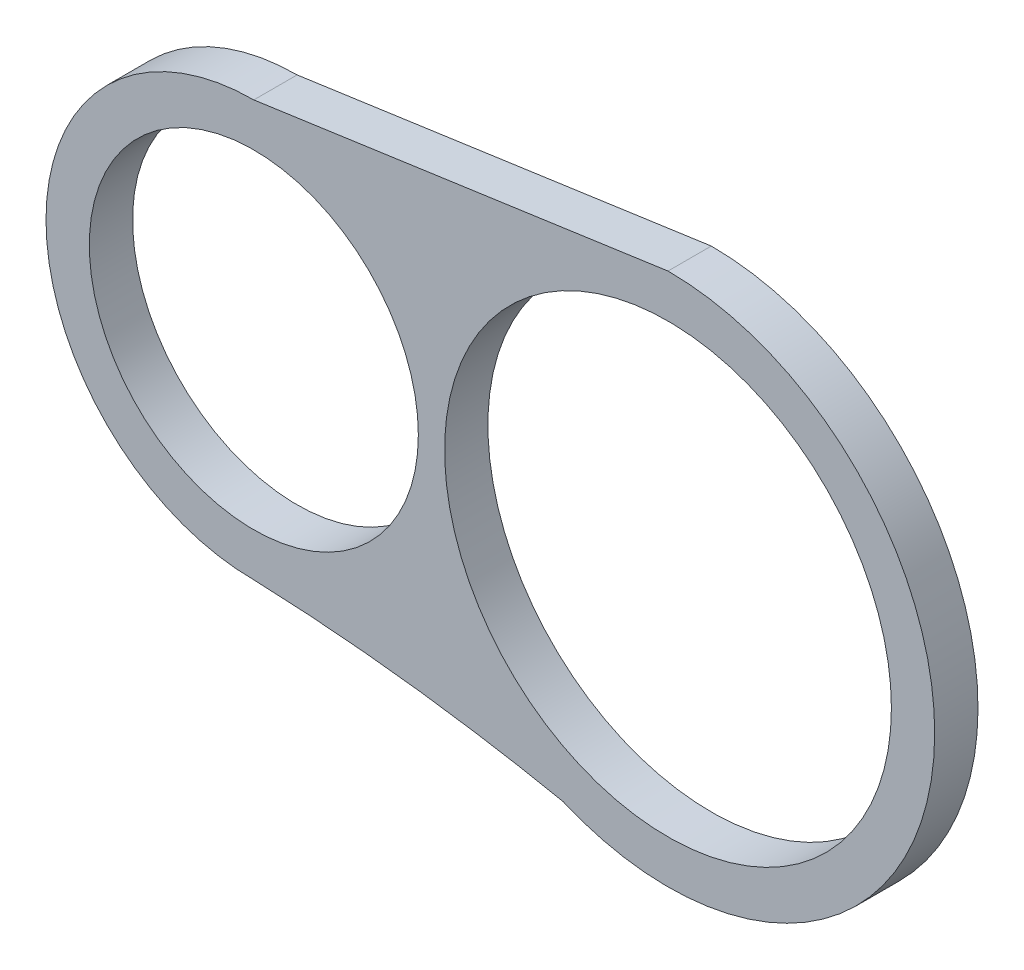
ISO-10303-21;
HEADER;
FILE_DESCRIPTION(('STEP AP214'),'2;1');
FILE_NAME('part.step','',(''),(''),'','','');
FILE_SCHEMA(('AUTOMOTIVE_DESIGN { 1 0 10303 214 1 1 1 1 }'));
ENDSEC;
DATA;
#1=APPLICATION_CONTEXT('core data for automotive mechanical design processes');
#2=APPLICATION_PROTOCOL_DEFINITION('international standard','automotive_design',2000,#1);
#3=PRODUCT_CONTEXT('',#1,'mechanical');
#4=PRODUCT('Part','Part','',(#3));
#5=PRODUCT_RELATED_PRODUCT_CATEGORY('part','',(#4));
#6=PRODUCT_DEFINITION_FORMATION('','',#4);
#7=PRODUCT_DEFINITION_CONTEXT('part definition',#1,'design');
#8=PRODUCT_DEFINITION('design','',#6,#7);
#9=PRODUCT_DEFINITION_SHAPE('','',#8);
#10=(LENGTH_UNIT() NAMED_UNIT(*) SI_UNIT(.MILLI.,.METRE.));
#11=(NAMED_UNIT(*) PLANE_ANGLE_UNIT() SI_UNIT($,.RADIAN.));
#12=(NAMED_UNIT(*) SI_UNIT($,.STERADIAN.) SOLID_ANGLE_UNIT());
#13=UNCERTAINTY_MEASURE_WITH_UNIT(LENGTH_MEASURE(1.E-05),#10,'distance_accuracy_value','');
#14=(GEOMETRIC_REPRESENTATION_CONTEXT(3) GLOBAL_UNCERTAINTY_ASSIGNED_CONTEXT((#13)) GLOBAL_UNIT_ASSIGNED_CONTEXT((#10,
#11,#12)) REPRESENTATION_CONTEXT('',''));
#15=CARTESIAN_POINT('',(0.,0.,0.));
#16=DIRECTION('',(0.,0.,1.));
#17=DIRECTION('',(1.,0.,0.));
#18=AXIS2_PLACEMENT_3D('',#15,#16,#17);
#19=CARTESIAN_POINT('',(-6.05642951738741,-25.4090840629229,5.));
#20=DIRECTION('',(0.,0.,1.));
#21=DIRECTION('',(1.,0.,0.));
#22=AXIS2_PLACEMENT_3D('',#19,#20,#21);
#23=PLANE('',#22);
#24=CARTESIAN_POINT('',(23.915,0.,5.));
#25=DIRECTION('',(0.,0.,1.));
#26=DIRECTION('',(1.,0.,0.));
#27=AXIS2_PLACEMENT_3D('',#24,#25,#26);
#28=CIRCLE('',#27,25.8);
#29=CARTESIAN_POINT('',(49.715,0.,5.));
#30=VERTEX_POINT('',#29);
#31=EDGE_CURVE('E108',#30,#30,#28,.T.);
#32=ORIENTED_EDGE('',*,*,#31,.F.);
#33=EDGE_LOOP('',(#32));
#34=FACE_BOUND('',#33,.T.);
#35=CARTESIAN_POINT('',(-23.915,-24.,5.));
#36=CARTESIAN_POINT('',(-6.05642951738735,-24.6590840629229,5.));
#37=CARTESIAN_POINT('',(11.8021409652251,-28.3181681258458,5.));
#38=B_SPLINE_CURVE_WITH_KNOTS('',2,(#35,#36,#37),.UNSPECIFIED.,.F.,.F.,(3,3),(0.,
0.746751849576107),.UNSPECIFIED.);
#39=CARTESIAN_POINT('',(-23.915,-24.,5.));
#40=VERTEX_POINT('',#39);
#41=CARTESIAN_POINT('',(11.8021409652251,-28.3181681258458,5.));
#42=VERTEX_POINT('',#41);
#43=EDGE_CURVE('E87',#40,#42,#38,.T.);
#44=ORIENTED_EDGE('',*,*,#43,.T.);
#45=CARTESIAN_POINT('',(23.915,0.,5.));
#46=DIRECTION('',(0.,0.,1.));
#47=DIRECTION('',(1.,0.,0.));
#48=AXIS2_PLACEMENT_3D('',#45,#46,#47);
#49=CIRCLE('',#48,30.8);
#50=CARTESIAN_POINT('',(23.9149999999999,30.8,5.));
#51=VERTEX_POINT('',#50);
#52=EDGE_CURVE('E82',#42,#51,#49,.T.);
#53=ORIENTED_EDGE('',*,*,#52,.T.);
#54=CARTESIAN_POINT('',(23.915,30.8,5.));
#55=CARTESIAN_POINT('',(-23.915,24.,5.));
#56=B_SPLINE_CURVE_WITH_KNOTS('',1,(#54,#55),.UNSPECIFIED.,.F.,.F.,(2,2),(0.,1.),.UNSPECIFIED.);
#57=CARTESIAN_POINT('',(-23.915,24.,5.));
#58=VERTEX_POINT('',#57);
#59=EDGE_CURVE('E85',#51,#58,#56,.T.);
#60=ORIENTED_EDGE('',*,*,#59,.T.);
#61=CARTESIAN_POINT('',(-23.915,0.,5.));
#62=DIRECTION('',(0.,0.,1.));
#63=DIRECTION('',(1.,0.,0.));
#64=AXIS2_PLACEMENT_3D('',#61,#62,#63);
#65=CIRCLE('',#64,24.);
#66=EDGE_CURVE('E52',#58,#40,#65,.T.);
#67=ORIENTED_EDGE('',*,*,#66,.T.);
#68=EDGE_LOOP('',(#44,#53,#60,#67));
#69=FACE_BOUND('',#68,.T.);
#70=CARTESIAN_POINT('',(-23.915,0.,5.));
#71=DIRECTION('',(0.,0.,1.));
#72=DIRECTION('',(1.,0.,0.));
#73=AXIS2_PLACEMENT_3D('',#70,#71,#72);
#74=CIRCLE('',#73,19.);
#75=CARTESIAN_POINT('',(-4.915,0.,5.));
#76=VERTEX_POINT('',#75);
#77=EDGE_CURVE('E137',#76,#76,#74,.T.);
#78=ORIENTED_EDGE('',*,*,#77,.F.);
#79=EDGE_LOOP('',(#78));
#80=FACE_BOUND('',#79,.T.);
#81=ADVANCED_FACE('F34',(#34,#69,#80),#23,.T.);
#82=CARTESIAN_POINT('',(-6.05642951738741,-25.4090840629229,0.));
#83=DIRECTION('',(0.,0.,1.));
#84=DIRECTION('',(1.,0.,0.));
#85=AXIS2_PLACEMENT_3D('',#82,#83,#84);
#86=PLANE('',#85);
#87=CARTESIAN_POINT('',(-23.915,-24.,0.));
#88=CARTESIAN_POINT('',(-6.05642951738735,-24.6590840629229,0.));
#89=CARTESIAN_POINT('',(11.8021409652251,-28.3181681258458,0.));
#90=B_SPLINE_CURVE_WITH_KNOTS('',2,(#87,#88,#89),.UNSPECIFIED.,.F.,.F.,(3,3),(0.,
0.746751849576107),.UNSPECIFIED.);
#91=CARTESIAN_POINT('',(-23.915,-24.,0.));
#92=VERTEX_POINT('',#91);
#93=CARTESIAN_POINT('',(11.8021409652251,-28.3181681258458,0.));
#94=VERTEX_POINT('',#93);
#95=EDGE_CURVE('E103',#92,#94,#90,.T.);
#96=ORIENTED_EDGE('',*,*,#95,.F.);
#97=CARTESIAN_POINT('',(-23.915,0.,0.));
#98=DIRECTION('',(0.,0.,1.));
#99=DIRECTION('',(1.,0.,0.));
#100=AXIS2_PLACEMENT_3D('',#97,#98,#99);
#101=CIRCLE('',#100,24.);
#102=CARTESIAN_POINT('',(-23.915,24.,0.));
#103=VERTEX_POINT('',#102);
#104=EDGE_CURVE('E75',#103,#92,#101,.T.);
#105=ORIENTED_EDGE('',*,*,#104,.F.);
#106=CARTESIAN_POINT('',(23.915,30.8,0.));
#107=CARTESIAN_POINT('',(-23.915,24.,0.));
#108=B_SPLINE_CURVE_WITH_KNOTS('',1,(#106,#107),.UNSPECIFIED.,.F.,.F.,(2,2),(0.,1.),.UNSPECIFIED.);
#109=CARTESIAN_POINT('',(23.9149999999999,30.8,0.));
#110=VERTEX_POINT('',#109);
#111=EDGE_CURVE('E69',#110,#103,#108,.T.);
#112=ORIENTED_EDGE('',*,*,#111,.F.);
#113=CARTESIAN_POINT('',(23.915,0.,0.));
#114=DIRECTION('',(0.,0.,1.));
#115=DIRECTION('',(1.,0.,0.));
#116=AXIS2_PLACEMENT_3D('',#113,#114,#115);
#117=CIRCLE('',#116,30.8);
#118=EDGE_CURVE('E91',#94,#110,#117,.T.);
#119=ORIENTED_EDGE('',*,*,#118,.F.);
#120=EDGE_LOOP('',(#96,#105,#112,#119));
#121=FACE_BOUND('',#120,.T.);
#122=CARTESIAN_POINT('',(23.915,0.,0.));
#123=DIRECTION('',(0.,0.,1.));
#124=DIRECTION('',(1.,0.,0.));
#125=AXIS2_PLACEMENT_3D('',#122,#123,#124);
#126=CIRCLE('',#125,25.8);
#127=CARTESIAN_POINT('',(49.715,0.,0.));
#128=VERTEX_POINT('',#127);
#129=EDGE_CURVE('E131',#128,#128,#126,.T.);
#130=ORIENTED_EDGE('',*,*,#129,.T.);
#131=EDGE_LOOP('',(#130));
#132=FACE_BOUND('',#131,.T.);
#133=CARTESIAN_POINT('',(-23.915,0.,0.));
#134=DIRECTION('',(0.,0.,1.));
#135=DIRECTION('',(1.,0.,0.));
#136=AXIS2_PLACEMENT_3D('',#133,#134,#135);
#137=CIRCLE('',#136,19.);
#138=CARTESIAN_POINT('',(-4.915,0.,0.));
#139=VERTEX_POINT('',#138);
#140=EDGE_CURVE('E140',#139,#139,#137,.T.);
#141=ORIENTED_EDGE('',*,*,#140,.T.);
#142=EDGE_LOOP('',(#141));
#143=FACE_BOUND('',#142,.T.);
#144=ADVANCED_FACE('F124',(#121,#132,#143),#86,.F.);
#145=DIRECTION('',(0.,0.,-1.));
#146=VECTOR('',#145,1.);
#147=SURFACE_OF_LINEAR_EXTRUSION('',#38,#146);
#148=ORIENTED_EDGE('',*,*,#95,.T.);
#149=DIRECTION('',(0.,0.,-1.));
#150=VECTOR('',#149,1.);
#151=CARTESIAN_POINT('',(11.8021409652251,-28.3181681258458,5.));
#152=LINE('',#151,#150);
#153=EDGE_CURVE('E11',#42,#94,#152,.T.);
#154=ORIENTED_EDGE('',*,*,#153,.F.);
#155=ORIENTED_EDGE('',*,*,#43,.F.);
#156=DIRECTION('',(0.,0.,-1.));
#157=VECTOR('',#156,1.);
#158=CARTESIAN_POINT('',(-23.915,-24.,5.));
#159=LINE('',#158,#157);
#160=EDGE_CURVE('E95',#40,#92,#159,.T.);
#161=ORIENTED_EDGE('',*,*,#160,.T.);
#162=EDGE_LOOP('',(#148,#154,#155,#161));
#163=FACE_BOUND('',#162,.T.);
#164=ADVANCED_FACE('F36',(#163),#147,.F.);
#165=CARTESIAN_POINT('',(23.915,0.,5.));
#166=DIRECTION('',(0.,0.,-1.));
#167=DIRECTION('',(-1.,0.,0.));
#168=AXIS2_PLACEMENT_3D('',#165,#166,#167);
#169=CYLINDRICAL_SURFACE('',#168,30.8);
#170=ORIENTED_EDGE('',*,*,#118,.T.);
#171=DIRECTION('',(0.,0.,-1.));
#172=VECTOR('',#171,1.);
#173=CARTESIAN_POINT('',(23.9149999999999,30.8,5.));
#174=LINE('',#173,#172);
#175=EDGE_CURVE('E44',#51,#110,#174,.T.);
#176=ORIENTED_EDGE('',*,*,#175,.F.);
#177=ORIENTED_EDGE('',*,*,#52,.F.);
#178=ORIENTED_EDGE('',*,*,#153,.T.);
#179=EDGE_LOOP('',(#170,#176,#177,#178));
#180=FACE_BOUND('',#179,.T.);
#181=ADVANCED_FACE('F90',(#180),#169,.T.);
#182=CARTESIAN_POINT('',(23.915,30.8,5.));
#183=DIRECTION('',(0.140754808765542,-0.990044485772925,0.));
#184=DIRECTION('',(0.990044485772925,0.140754808765542,0.));
#185=AXIS2_PLACEMENT_3D('',#182,#183,#184);
#186=PLANE('',#185);
#187=ORIENTED_EDGE('',*,*,#111,.T.);
#188=DIRECTION('',(0.,0.,-1.));
#189=VECTOR('',#188,1.);
#190=CARTESIAN_POINT('',(-23.915,24.,5.));
#191=LINE('',#190,#189);
#192=EDGE_CURVE('E92',#58,#103,#191,.T.);
#193=ORIENTED_EDGE('',*,*,#192,.F.);
#194=ORIENTED_EDGE('',*,*,#59,.F.);
#195=ORIENTED_EDGE('',*,*,#175,.T.);
#196=EDGE_LOOP('',(#187,#193,#194,#195));
#197=FACE_BOUND('',#196,.T.);
#198=ADVANCED_FACE('F93',(#197),#186,.F.);
#199=CARTESIAN_POINT('',(-23.915,0.,5.));
#200=DIRECTION('',(0.,0.,-1.));
#201=DIRECTION('',(-1.,0.,0.));
#202=AXIS2_PLACEMENT_3D('',#199,#200,#201);
#203=CYLINDRICAL_SURFACE('',#202,24.);
#204=ORIENTED_EDGE('',*,*,#104,.T.);
#205=ORIENTED_EDGE('',*,*,#160,.F.);
#206=ORIENTED_EDGE('',*,*,#66,.F.);
#207=ORIENTED_EDGE('',*,*,#192,.T.);
#208=EDGE_LOOP('',(#204,#205,#206,#207));
#209=FACE_BOUND('',#208,.T.);
#210=ADVANCED_FACE('F121',(#209),#203,.T.);
#211=CARTESIAN_POINT('',(23.915,0.,5.));
#212=DIRECTION('',(0.,0.,-1.));
#213=DIRECTION('',(-1.,0.,0.));
#214=AXIS2_PLACEMENT_3D('',#211,#212,#213);
#215=CYLINDRICAL_SURFACE('',#214,25.8);
#216=ORIENTED_EDGE('',*,*,#31,.T.);
#217=EDGE_LOOP('',(#216));
#218=FACE_BOUND('',#217,.T.);
#219=ORIENTED_EDGE('',*,*,#129,.F.);
#220=EDGE_LOOP('',(#219));
#221=FACE_BOUND('',#220,.T.);
#222=ADVANCED_FACE('F157',(#218,#221),#215,.F.);
#223=CARTESIAN_POINT('',(-23.915,0.,5.));
#224=DIRECTION('',(0.,0.,-1.));
#225=DIRECTION('',(-1.,0.,0.));
#226=AXIS2_PLACEMENT_3D('',#223,#224,#225);
#227=CYLINDRICAL_SURFACE('',#226,19.);
#228=ORIENTED_EDGE('',*,*,#77,.T.);
#229=EDGE_LOOP('',(#228));
#230=FACE_BOUND('',#229,.T.);
#231=ORIENTED_EDGE('',*,*,#140,.F.);
#232=EDGE_LOOP('',(#231));
#233=FACE_BOUND('',#232,.T.);
#234=ADVANCED_FACE('F146',(#230,#233),#227,.F.);
#235=CLOSED_SHELL('',(#81,#144,#164,#181,#198,#210,#222,#234));
#236=MANIFOLD_SOLID_BREP('B2',#235);
#237=ADVANCED_BREP_SHAPE_REPRESENTATION('',(#18,#236),#14);
#238=SHAPE_DEFINITION_REPRESENTATION(#9,#237);
ENDSEC;
END-ISO-10303-21;
